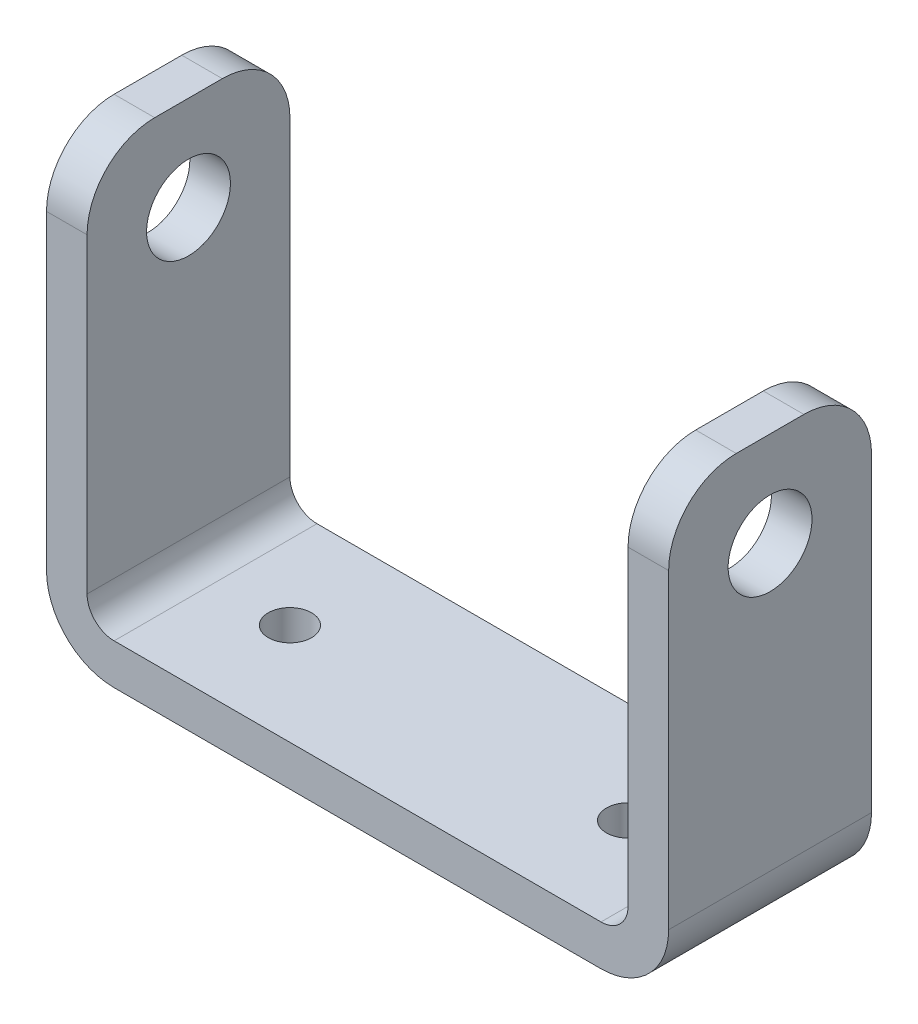
ISO-10303-21;
HEADER;
FILE_DESCRIPTION(('STEP AP214'),'2;1');
FILE_NAME('part.step','',(''),(''),'','','');
FILE_SCHEMA(('AUTOMOTIVE_DESIGN { 1 0 10303 214 1 1 1 1 }'));
ENDSEC;
DATA;
#1=APPLICATION_CONTEXT('core data for automotive mechanical design processes');
#2=APPLICATION_PROTOCOL_DEFINITION('international standard','automotive_design',2000,#1);
#3=PRODUCT_CONTEXT('',#1,'mechanical');
#4=PRODUCT('Part','Part','',(#3));
#5=PRODUCT_RELATED_PRODUCT_CATEGORY('part','',(#4));
#6=PRODUCT_DEFINITION_FORMATION('','',#4);
#7=PRODUCT_DEFINITION_CONTEXT('part definition',#1,'design');
#8=PRODUCT_DEFINITION('design','',#6,#7);
#9=PRODUCT_DEFINITION_SHAPE('','',#8);
#10=(LENGTH_UNIT() NAMED_UNIT(*) SI_UNIT(.MILLI.,.METRE.));
#11=(NAMED_UNIT(*) PLANE_ANGLE_UNIT() SI_UNIT($,.RADIAN.));
#12=(NAMED_UNIT(*) SI_UNIT($,.STERADIAN.) SOLID_ANGLE_UNIT());
#13=UNCERTAINTY_MEASURE_WITH_UNIT(LENGTH_MEASURE(1.E-05),#10,'distance_accuracy_value','');
#14=(GEOMETRIC_REPRESENTATION_CONTEXT(3) GLOBAL_UNCERTAINTY_ASSIGNED_CONTEXT((#13)) GLOBAL_UNIT_ASSIGNED_CONTEXT((#10,
#11,#12)) REPRESENTATION_CONTEXT('',''));
#15=CARTESIAN_POINT('',(0.,0.,0.));
#16=DIRECTION('',(0.,0.,1.));
#17=DIRECTION('',(1.,0.,0.));
#18=AXIS2_PLACEMENT_3D('',#15,#16,#17);
#19=CARTESIAN_POINT('',(0.,0.,15.));
#20=DIRECTION('',(0.,-1.,0.));
#21=DIRECTION('',(0.,0.,-1.));
#22=AXIS2_PLACEMENT_3D('',#19,#20,#21);
#23=PLANE('',#22);
#24=DIRECTION('',(0.,0.,-1.));
#25=VECTOR('',#24,1.);
#26=CARTESIAN_POINT('',(0.,0.,15.));
#27=LINE('',#26,#25);
#28=CARTESIAN_POINT('',(0.,0.,10.));
#29=VERTEX_POINT('',#28);
#30=CARTESIAN_POINT('',(0.,0.,5.));
#31=VERTEX_POINT('',#30);
#32=EDGE_CURVE('E283',#29,#31,#27,.T.);
#33=ORIENTED_EDGE('',*,*,#32,.T.);
#34=DIRECTION('',(-1.,0.,0.));
#35=VECTOR('',#34,1.);
#36=CARTESIAN_POINT('',(0.,0.,5.));
#37=LINE('',#36,#35);
#38=CARTESIAN_POINT('',(-3.,0.,5.));
#39=VERTEX_POINT('',#38);
#40=EDGE_CURVE('E166',#31,#39,#37,.T.);
#41=ORIENTED_EDGE('',*,*,#40,.T.);
#42=DIRECTION('',(0.,0.,-1.));
#43=VECTOR('',#42,1.);
#44=CARTESIAN_POINT('',(-3.,0.,15.));
#45=LINE('',#44,#43);
#46=CARTESIAN_POINT('',(-3.,0.,10.));
#47=VERTEX_POINT('',#46);
#48=EDGE_CURVE('E159',#47,#39,#45,.T.);
#49=ORIENTED_EDGE('',*,*,#48,.F.);
#50=DIRECTION('',(-1.,0.,0.));
#51=VECTOR('',#50,1.);
#52=CARTESIAN_POINT('',(0.,0.,10.));
#53=LINE('',#52,#51);
#54=EDGE_CURVE('E171',#47,#29,#53,.F.);
#55=ORIENTED_EDGE('',*,*,#54,.T.);
#56=EDGE_LOOP('',(#33,#41,#49,#55));
#57=FACE_BOUND('',#56,.T.);
#58=ADVANCED_FACE('F43',(#57),#23,.F.);
#59=CARTESIAN_POINT('',(-3.,0.,15.));
#60=DIRECTION('',(1.,0.,0.));
#61=DIRECTION('',(0.,1.,0.));
#62=AXIS2_PLACEMENT_3D('',#59,#60,#61);
#63=PLANE('',#62);
#64=CARTESIAN_POINT('',(-3.,-7.00000000000001,7.5));
#65=DIRECTION('',(1.,0.,0.));
#66=DIRECTION('',(0.,0.,-1.));
#67=AXIS2_PLACEMENT_3D('',#64,#65,#66);
#68=CIRCLE('',#67,3.1);
#69=CARTESIAN_POINT('',(-3.,-7.00000000000001,4.4));
#70=VERTEX_POINT('',#69);
#71=EDGE_CURVE('E326',#70,#70,#68,.T.);
#72=ORIENTED_EDGE('',*,*,#71,.T.);
#73=EDGE_LOOP('',(#72));
#74=FACE_BOUND('',#73,.T.);
#75=DIRECTION('',(0.,-1.,0.));
#76=VECTOR('',#75,1.);
#77=CARTESIAN_POINT('',(-3.,0.,0.));
#78=LINE('',#77,#76);
#79=CARTESIAN_POINT('',(-3.,-5.,0.));
#80=VERTEX_POINT('',#79);
#81=CARTESIAN_POINT('',(-3.,-28.,0.));
#82=VERTEX_POINT('',#81);
#83=EDGE_CURVE('E268',#80,#82,#78,.T.);
#84=ORIENTED_EDGE('',*,*,#83,.T.);
#85=DIRECTION('',(0.,0.,-1.));
#86=VECTOR('',#85,1.);
#87=CARTESIAN_POINT('',(-3.,-28.,15.));
#88=LINE('',#87,#86);
#89=CARTESIAN_POINT('',(-3.,-28.,15.));
#90=VERTEX_POINT('',#89);
#91=EDGE_CURVE('E11',#82,#90,#88,.F.);
#92=ORIENTED_EDGE('',*,*,#91,.T.);
#93=DIRECTION('',(0.,-1.,0.));
#94=VECTOR('',#93,1.);
#95=CARTESIAN_POINT('',(-3.,0.,15.));
#96=LINE('',#95,#94);
#97=CARTESIAN_POINT('',(-3.,-5.,15.));
#98=VERTEX_POINT('',#97);
#99=EDGE_CURVE('E160',#98,#90,#96,.T.);
#100=ORIENTED_EDGE('',*,*,#99,.F.);
#101=CARTESIAN_POINT('',(-3.,-5.,10.));
#102=DIRECTION('',(1.,0.,0.));
#103=DIRECTION('',(0.,1.,0.));
#104=AXIS2_PLACEMENT_3D('',#101,#102,#103);
#105=CIRCLE('',#104,5.);
#106=EDGE_CURVE('E156',#98,#47,#105,.F.);
#107=ORIENTED_EDGE('',*,*,#106,.T.);
#108=ORIENTED_EDGE('',*,*,#48,.T.);
#109=CARTESIAN_POINT('',(-3.,-5.,5.));
#110=DIRECTION('',(1.,0.,0.));
#111=DIRECTION('',(0.,1.,0.));
#112=AXIS2_PLACEMENT_3D('',#109,#110,#111);
#113=CIRCLE('',#112,5.);
#114=EDGE_CURVE('E165',#39,#80,#113,.F.);
#115=ORIENTED_EDGE('',*,*,#114,.T.);
#116=EDGE_LOOP('',(#84,#92,#100,#107,#108,#115));
#117=FACE_BOUND('',#116,.T.);
#118=ADVANCED_FACE('F158',(#74,#117),#63,.F.);
#119=CARTESIAN_POINT('',(-3.,-33.,15.));
#120=DIRECTION('',(0.,1.,0.));
#121=DIRECTION('',(0.,0.,1.));
#122=AXIS2_PLACEMENT_3D('',#119,#120,#121);
#123=PLANE('',#122);
#124=CARTESIAN_POINT('',(7.5,-33.,7.5));
#125=DIRECTION('',(0.,1.,0.));
#126=DIRECTION('',(0.,0.,1.));
#127=AXIS2_PLACEMENT_3D('',#124,#125,#126);
#128=CIRCLE('',#127,1.6);
#129=CARTESIAN_POINT('',(7.5,-33.,9.1));
#130=VERTEX_POINT('',#129);
#131=EDGE_CURVE('E327',#130,#130,#128,.T.);
#132=ORIENTED_EDGE('',*,*,#131,.T.);
#133=EDGE_LOOP('',(#132));
#134=FACE_BOUND('',#133,.T.);
#135=CARTESIAN_POINT('',(32.5,-33.,7.5));
#136=DIRECTION('',(0.,1.,0.));
#137=DIRECTION('',(0.,0.,1.));
#138=AXIS2_PLACEMENT_3D('',#135,#136,#137);
#139=CIRCLE('',#138,1.6);
#140=CARTESIAN_POINT('',(32.5,-33.,9.09999999999999));
#141=VERTEX_POINT('',#140);
#142=EDGE_CURVE('E330',#141,#141,#139,.T.);
#143=ORIENTED_EDGE('',*,*,#142,.T.);
#144=EDGE_LOOP('',(#143));
#145=FACE_BOUND('',#144,.T.);
#146=DIRECTION('',(1.,0.,0.));
#147=VECTOR('',#146,1.);
#148=CARTESIAN_POINT('',(-3.,-33.,0.));
#149=LINE('',#148,#147);
#150=CARTESIAN_POINT('',(2.,-33.,0.));
#151=VERTEX_POINT('',#150);
#152=CARTESIAN_POINT('',(38.,-33.,0.));
#153=VERTEX_POINT('',#152);
#154=EDGE_CURVE('E264',#151,#153,#149,.T.);
#155=ORIENTED_EDGE('',*,*,#154,.T.);
#156=DIRECTION('',(0.,0.,-1.));
#157=VECTOR('',#156,1.);
#158=CARTESIAN_POINT('',(38.,-33.,15.));
#159=LINE('',#158,#157);
#160=CARTESIAN_POINT('',(38.,-33.,15.));
#161=VERTEX_POINT('',#160);
#162=EDGE_CURVE('E64',#153,#161,#159,.F.);
#163=ORIENTED_EDGE('',*,*,#162,.T.);
#164=DIRECTION('',(1.,0.,0.));
#165=VECTOR('',#164,1.);
#166=CARTESIAN_POINT('',(-3.,-33.,15.));
#167=LINE('',#166,#165);
#168=CARTESIAN_POINT('',(2.,-33.,15.));
#169=VERTEX_POINT('',#168);
#170=EDGE_CURVE('E249',#169,#161,#167,.T.);
#171=ORIENTED_EDGE('',*,*,#170,.F.);
#172=DIRECTION('',(0.,0.,-1.));
#173=VECTOR('',#172,1.);
#174=CARTESIAN_POINT('',(2.,-33.,15.));
#175=LINE('',#174,#173);
#176=EDGE_CURVE('E239',#169,#151,#175,.T.);
#177=ORIENTED_EDGE('',*,*,#176,.T.);
#178=EDGE_LOOP('',(#155,#163,#171,#177));
#179=FACE_BOUND('',#178,.T.);
#180=ADVANCED_FACE('F266',(#134,#145,#179),#123,.F.);
#181=CARTESIAN_POINT('',(43.,-33.,15.));
#182=DIRECTION('',(-1.,0.,0.));
#183=DIRECTION('',(0.,-1.,0.));
#184=AXIS2_PLACEMENT_3D('',#181,#182,#183);
#185=PLANE('',#184);
#186=CARTESIAN_POINT('',(43.,-7.00000000000001,7.5));
#187=DIRECTION('',(1.,0.,0.));
#188=DIRECTION('',(0.,0.,-1.));
#189=AXIS2_PLACEMENT_3D('',#186,#187,#188);
#190=CIRCLE('',#189,3.1);
#191=CARTESIAN_POINT('',(43.,-7.00000000000001,4.4));
#192=VERTEX_POINT('',#191);
#193=EDGE_CURVE('E323',#192,#192,#190,.T.);
#194=ORIENTED_EDGE('',*,*,#193,.F.);
#195=EDGE_LOOP('',(#194));
#196=FACE_BOUND('',#195,.T.);
#197=DIRECTION('',(0.,1.,0.));
#198=VECTOR('',#197,1.);
#199=CARTESIAN_POINT('',(43.,-33.,15.));
#200=LINE('',#199,#198);
#201=CARTESIAN_POINT('',(43.,-28.,15.));
#202=VERTEX_POINT('',#201);
#203=CARTESIAN_POINT('',(43.,-4.99999999999999,15.));
#204=VERTEX_POINT('',#203);
#205=EDGE_CURVE('E248',#202,#204,#200,.T.);
#206=ORIENTED_EDGE('',*,*,#205,.F.);
#207=DIRECTION('',(0.,0.,-1.));
#208=VECTOR('',#207,1.);
#209=CARTESIAN_POINT('',(43.,-28.,15.));
#210=LINE('',#209,#208);
#211=CARTESIAN_POINT('',(43.,-28.,0.));
#212=VERTEX_POINT('',#211);
#213=EDGE_CURVE('E232',#202,#212,#210,.T.);
#214=ORIENTED_EDGE('',*,*,#213,.T.);
#215=DIRECTION('',(0.,1.,0.));
#216=VECTOR('',#215,1.);
#217=CARTESIAN_POINT('',(43.,-33.,0.));
#218=LINE('',#217,#216);
#219=CARTESIAN_POINT('',(43.,-4.99999999999999,0.));
#220=VERTEX_POINT('',#219);
#221=EDGE_CURVE('E265',#212,#220,#218,.T.);
#222=ORIENTED_EDGE('',*,*,#221,.T.);
#223=CARTESIAN_POINT('',(43.,-4.99999999999999,5.));
#224=DIRECTION('',(-1.,0.,0.));
#225=DIRECTION('',(0.,-1.,0.));
#226=AXIS2_PLACEMENT_3D('',#223,#224,#225);
#227=CIRCLE('',#226,5.);
#228=CARTESIAN_POINT('',(43.,0.,5.));
#229=VERTEX_POINT('',#228);
#230=EDGE_CURVE('E212',#220,#229,#227,.F.);
#231=ORIENTED_EDGE('',*,*,#230,.T.);
#232=DIRECTION('',(0.,0.,-1.));
#233=VECTOR('',#232,1.);
#234=CARTESIAN_POINT('',(43.,0.,15.));
#235=LINE('',#234,#233);
#236=CARTESIAN_POINT('',(43.,0.,10.));
#237=VERTEX_POINT('',#236);
#238=EDGE_CURVE('E174',#237,#229,#235,.T.);
#239=ORIENTED_EDGE('',*,*,#238,.F.);
#240=CARTESIAN_POINT('',(43.,-4.99999999999999,10.));
#241=DIRECTION('',(-1.,0.,0.));
#242=DIRECTION('',(0.,-1.,0.));
#243=AXIS2_PLACEMENT_3D('',#240,#241,#242);
#244=CIRCLE('',#243,5.);
#245=EDGE_CURVE('E209',#237,#204,#244,.F.);
#246=ORIENTED_EDGE('',*,*,#245,.T.);
#247=EDGE_LOOP('',(#206,#214,#222,#231,#239,#246));
#248=FACE_BOUND('',#247,.T.);
#249=ADVANCED_FACE('F253',(#196,#248),#185,.F.);
#250=CARTESIAN_POINT('',(40.,0.,15.));
#251=DIRECTION('',(0.,-1.,0.));
#252=DIRECTION('',(0.,0.,-1.));
#253=AXIS2_PLACEMENT_3D('',#250,#251,#252);
#254=PLANE('',#253);
#255=ORIENTED_EDGE('',*,*,#238,.T.);
#256=DIRECTION('',(-1.,0.,0.));
#257=VECTOR('',#256,1.);
#258=CARTESIAN_POINT('',(40.,0.,5.));
#259=LINE('',#258,#257);
#260=CARTESIAN_POINT('',(40.,0.,5.));
#261=VERTEX_POINT('',#260);
#262=EDGE_CURVE('E202',#229,#261,#259,.T.);
#263=ORIENTED_EDGE('',*,*,#262,.T.);
#264=DIRECTION('',(0.,0.,-1.));
#265=VECTOR('',#264,1.);
#266=CARTESIAN_POINT('',(40.,0.,15.));
#267=LINE('',#266,#265);
#268=CARTESIAN_POINT('',(40.,0.,10.));
#269=VERTEX_POINT('',#268);
#270=EDGE_CURVE('E285',#269,#261,#267,.T.);
#271=ORIENTED_EDGE('',*,*,#270,.F.);
#272=DIRECTION('',(-1.,0.,0.));
#273=VECTOR('',#272,1.);
#274=CARTESIAN_POINT('',(43.,0.,10.));
#275=LINE('',#274,#273);
#276=EDGE_CURVE('E200',#269,#237,#275,.F.);
#277=ORIENTED_EDGE('',*,*,#276,.T.);
#278=EDGE_LOOP('',(#255,#263,#271,#277));
#279=FACE_BOUND('',#278,.T.);
#280=ADVANCED_FACE('F292',(#279),#254,.F.);
#281=CARTESIAN_POINT('',(40.,-30.,15.));
#282=DIRECTION('',(1.,0.,0.));
#283=DIRECTION('',(0.,1.,0.));
#284=AXIS2_PLACEMENT_3D('',#281,#282,#283);
#285=PLANE('',#284);
#286=CARTESIAN_POINT('',(40.,-7.00000000000001,7.5));
#287=DIRECTION('',(1.,0.,0.));
#288=DIRECTION('',(0.,1.,0.));
#289=AXIS2_PLACEMENT_3D('',#286,#287,#288);
#290=CIRCLE('',#289,3.1);
#291=CARTESIAN_POINT('',(40.,-3.90000000000001,7.5));
#292=VERTEX_POINT('',#291);
#293=EDGE_CURVE('E272',#292,#292,#290,.T.);
#294=ORIENTED_EDGE('',*,*,#293,.T.);
#295=EDGE_LOOP('',(#294));
#296=FACE_BOUND('',#295,.T.);
#297=DIRECTION('',(0.,-1.,0.));
#298=VECTOR('',#297,1.);
#299=CARTESIAN_POINT('',(40.,-30.,0.));
#300=LINE('',#299,#298);
#301=CARTESIAN_POINT('',(40.,-4.99999999999999,0.));
#302=VERTEX_POINT('',#301);
#303=CARTESIAN_POINT('',(40.,-28.,0.));
#304=VERTEX_POINT('',#303);
#305=EDGE_CURVE('E270',#302,#304,#300,.T.);
#306=ORIENTED_EDGE('',*,*,#305,.T.);
#307=DIRECTION('',(0.,0.,-1.));
#308=VECTOR('',#307,1.);
#309=CARTESIAN_POINT('',(40.,-28.,15.));
#310=LINE('',#309,#308);
#311=CARTESIAN_POINT('',(40.,-28.,15.));
#312=VERTEX_POINT('',#311);
#313=EDGE_CURVE('E219',#304,#312,#310,.F.);
#314=ORIENTED_EDGE('',*,*,#313,.T.);
#315=DIRECTION('',(0.,-1.,0.));
#316=VECTOR('',#315,1.);
#317=CARTESIAN_POINT('',(40.,-30.,15.));
#318=LINE('',#317,#316);
#319=CARTESIAN_POINT('',(40.,-4.99999999999999,15.));
#320=VERTEX_POINT('',#319);
#321=EDGE_CURVE('E258',#320,#312,#318,.T.);
#322=ORIENTED_EDGE('',*,*,#321,.F.);
#323=CARTESIAN_POINT('',(40.,-4.99999999999999,10.));
#324=DIRECTION('',(1.,0.,0.));
#325=DIRECTION('',(0.,1.,0.));
#326=AXIS2_PLACEMENT_3D('',#323,#324,#325);
#327=CIRCLE('',#326,5.);
#328=EDGE_CURVE('E205',#320,#269,#327,.F.);
#329=ORIENTED_EDGE('',*,*,#328,.T.);
#330=ORIENTED_EDGE('',*,*,#270,.T.);
#331=CARTESIAN_POINT('',(40.,-4.99999999999999,5.));
#332=DIRECTION('',(1.,0.,0.));
#333=DIRECTION('',(0.,1.,0.));
#334=AXIS2_PLACEMENT_3D('',#331,#332,#333);
#335=CIRCLE('',#334,5.);
#336=EDGE_CURVE('E207',#261,#302,#335,.F.);
#337=ORIENTED_EDGE('',*,*,#336,.T.);
#338=EDGE_LOOP('',(#306,#314,#322,#329,#330,#337));
#339=FACE_BOUND('',#338,.T.);
#340=ADVANCED_FACE('F301',(#296,#339),#285,.F.);
#341=CARTESIAN_POINT('',(0.,-30.,15.));
#342=DIRECTION('',(0.,-1.,0.));
#343=DIRECTION('',(0.,0.,-1.));
#344=AXIS2_PLACEMENT_3D('',#341,#342,#343);
#345=PLANE('',#344);
#346=CARTESIAN_POINT('',(7.5,-30.,7.5));
#347=DIRECTION('',(0.,1.,0.));
#348=DIRECTION('',(0.,0.,1.));
#349=AXIS2_PLACEMENT_3D('',#346,#347,#348);
#350=CIRCLE('',#349,1.6);
#351=CARTESIAN_POINT('',(7.5,-30.,9.1));
#352=VERTEX_POINT('',#351);
#353=EDGE_CURVE('E336',#352,#352,#350,.T.);
#354=ORIENTED_EDGE('',*,*,#353,.F.);
#355=EDGE_LOOP('',(#354));
#356=FACE_BOUND('',#355,.T.);
#357=CARTESIAN_POINT('',(32.5,-30.,7.5));
#358=DIRECTION('',(0.,1.,0.));
#359=DIRECTION('',(0.,0.,1.));
#360=AXIS2_PLACEMENT_3D('',#357,#358,#359);
#361=CIRCLE('',#360,1.6);
#362=CARTESIAN_POINT('',(32.5,-30.,9.09999999999999));
#363=VERTEX_POINT('',#362);
#364=EDGE_CURVE('E333',#363,#363,#361,.T.);
#365=ORIENTED_EDGE('',*,*,#364,.F.);
#366=EDGE_LOOP('',(#365));
#367=FACE_BOUND('',#366,.T.);
#368=DIRECTION('',(-1.,0.,0.));
#369=VECTOR('',#368,1.);
#370=CARTESIAN_POINT('',(0.,-30.,15.));
#371=LINE('',#370,#369);
#372=CARTESIAN_POINT('',(38.,-30.,15.));
#373=VERTEX_POINT('',#372);
#374=CARTESIAN_POINT('',(2.,-30.,15.));
#375=VERTEX_POINT('',#374);
#376=EDGE_CURVE('E313',#373,#375,#371,.T.);
#377=ORIENTED_EDGE('',*,*,#376,.F.);
#378=DIRECTION('',(0.,0.,-1.));
#379=VECTOR('',#378,1.);
#380=CARTESIAN_POINT('',(38.,-30.,0.));
#381=LINE('',#380,#379);
#382=CARTESIAN_POINT('',(38.,-30.,0.));
#383=VERTEX_POINT('',#382);
#384=EDGE_CURVE('E216',#373,#383,#381,.T.);
#385=ORIENTED_EDGE('',*,*,#384,.T.);
#386=DIRECTION('',(-1.,0.,0.));
#387=VECTOR('',#386,1.);
#388=CARTESIAN_POINT('',(0.,-30.,0.));
#389=LINE('',#388,#387);
#390=CARTESIAN_POINT('',(2.,-30.,0.));
#391=VERTEX_POINT('',#390);
#392=EDGE_CURVE('E278',#383,#391,#389,.T.);
#393=ORIENTED_EDGE('',*,*,#392,.T.);
#394=DIRECTION('',(0.,0.,-1.));
#395=VECTOR('',#394,1.);
#396=CARTESIAN_POINT('',(2.,-30.,15.));
#397=LINE('',#396,#395);
#398=EDGE_CURVE('E214',#391,#375,#397,.F.);
#399=ORIENTED_EDGE('',*,*,#398,.T.);
#400=EDGE_LOOP('',(#377,#385,#393,#399));
#401=FACE_BOUND('',#400,.T.);
#402=ADVANCED_FACE('F310',(#356,#367,#401),#345,.F.);
#403=CARTESIAN_POINT('',(0.,0.,15.));
#404=DIRECTION('',(-1.,0.,0.));
#405=DIRECTION('',(0.,-1.,0.));
#406=AXIS2_PLACEMENT_3D('',#403,#404,#405);
#407=PLANE('',#406);
#408=CARTESIAN_POINT('',(0.,-7.00000000000001,7.5));
#409=DIRECTION('',(-1.,0.,0.));
#410=DIRECTION('',(0.,-1.,0.));
#411=AXIS2_PLACEMENT_3D('',#408,#409,#410);
#412=CIRCLE('',#411,3.1);
#413=CARTESIAN_POINT('',(0.,-10.1,7.5));
#414=VERTEX_POINT('',#413);
#415=EDGE_CURVE('E183',#414,#414,#412,.T.);
#416=ORIENTED_EDGE('',*,*,#415,.T.);
#417=EDGE_LOOP('',(#416));
#418=FACE_BOUND('',#417,.T.);
#419=DIRECTION('',(0.,1.,0.));
#420=VECTOR('',#419,1.);
#421=CARTESIAN_POINT('',(0.,0.,15.));
#422=LINE('',#421,#420);
#423=CARTESIAN_POINT('',(0.,-28.,15.));
#424=VERTEX_POINT('',#423);
#425=CARTESIAN_POINT('',(0.,-5.,15.));
#426=VERTEX_POINT('',#425);
#427=EDGE_CURVE('E286',#424,#426,#422,.T.);
#428=ORIENTED_EDGE('',*,*,#427,.F.);
#429=DIRECTION('',(0.,0.,-1.));
#430=VECTOR('',#429,1.);
#431=CARTESIAN_POINT('',(0.,-28.,0.));
#432=LINE('',#431,#430);
#433=CARTESIAN_POINT('',(0.,-28.,0.));
#434=VERTEX_POINT('',#433);
#435=EDGE_CURVE('E221',#424,#434,#432,.T.);
#436=ORIENTED_EDGE('',*,*,#435,.T.);
#437=DIRECTION('',(0.,1.,0.));
#438=VECTOR('',#437,1.);
#439=CARTESIAN_POINT('',(0.,0.,0.));
#440=LINE('',#439,#438);
#441=CARTESIAN_POINT('',(0.,-5.,0.));
#442=VERTEX_POINT('',#441);
#443=EDGE_CURVE('E281',#434,#442,#440,.T.);
#444=ORIENTED_EDGE('',*,*,#443,.T.);
#445=CARTESIAN_POINT('',(0.,-5.,5.));
#446=DIRECTION('',(-1.,0.,0.));
#447=DIRECTION('',(0.,-1.,0.));
#448=AXIS2_PLACEMENT_3D('',#445,#446,#447);
#449=CIRCLE('',#448,5.);
#450=EDGE_CURVE('E193',#442,#31,#449,.F.);
#451=ORIENTED_EDGE('',*,*,#450,.T.);
#452=ORIENTED_EDGE('',*,*,#32,.F.);
#453=CARTESIAN_POINT('',(0.,-5.,10.));
#454=DIRECTION('',(-1.,0.,0.));
#455=DIRECTION('',(0.,-1.,0.));
#456=AXIS2_PLACEMENT_3D('',#453,#454,#455);
#457=CIRCLE('',#456,5.);
#458=EDGE_CURVE('E179',#29,#426,#457,.F.);
#459=ORIENTED_EDGE('',*,*,#458,.T.);
#460=EDGE_LOOP('',(#428,#436,#444,#451,#452,#459));
#461=FACE_BOUND('',#460,.T.);
#462=ADVANCED_FACE('F353',(#418,#461),#407,.F.);
#463=CARTESIAN_POINT('',(0.,0.,15.));
#464=DIRECTION('',(0.,0.,1.));
#465=DIRECTION('',(1.,0.,0.));
#466=AXIS2_PLACEMENT_3D('',#463,#464,#465);
#467=PLANE('',#466);
#468=ORIENTED_EDGE('',*,*,#170,.T.);
#469=CARTESIAN_POINT('',(38.,-28.,15.));
#470=DIRECTION('',(0.,0.,1.));
#471=DIRECTION('',(1.,0.,0.));
#472=AXIS2_PLACEMENT_3D('',#469,#470,#471);
#473=CIRCLE('',#472,5.);
#474=EDGE_CURVE('E51',#161,#202,#473,.T.);
#475=ORIENTED_EDGE('',*,*,#474,.T.);
#476=ORIENTED_EDGE('',*,*,#205,.T.);
#477=DIRECTION('',(-1.,0.,0.));
#478=VECTOR('',#477,1.);
#479=CARTESIAN_POINT('',(40.,-4.99999999999999,15.));
#480=LINE('',#479,#478);
#481=EDGE_CURVE('E195',#204,#320,#480,.T.);
#482=ORIENTED_EDGE('',*,*,#481,.T.);
#483=ORIENTED_EDGE('',*,*,#321,.T.);
#484=CARTESIAN_POINT('',(38.,-28.,15.));
#485=DIRECTION('',(0.,0.,1.));
#486=DIRECTION('',(1.,0.,0.));
#487=AXIS2_PLACEMENT_3D('',#484,#485,#486);
#488=CIRCLE('',#487,2.);
#489=EDGE_CURVE('E226',#312,#373,#488,.F.);
#490=ORIENTED_EDGE('',*,*,#489,.T.);
#491=ORIENTED_EDGE('',*,*,#376,.T.);
#492=CARTESIAN_POINT('',(2.,-28.,15.));
#493=DIRECTION('',(0.,0.,1.));
#494=DIRECTION('',(1.,0.,0.));
#495=AXIS2_PLACEMENT_3D('',#492,#493,#494);
#496=CIRCLE('',#495,2.);
#497=EDGE_CURVE('E230',#375,#424,#496,.F.);
#498=ORIENTED_EDGE('',*,*,#497,.T.);
#499=ORIENTED_EDGE('',*,*,#427,.T.);
#500=DIRECTION('',(-1.,0.,0.));
#501=VECTOR('',#500,1.);
#502=CARTESIAN_POINT('',(-3.,-5.,15.));
#503=LINE('',#502,#501);
#504=EDGE_CURVE('E198',#426,#98,#503,.T.);
#505=ORIENTED_EDGE('',*,*,#504,.T.);
#506=ORIENTED_EDGE('',*,*,#99,.T.);
#507=CARTESIAN_POINT('',(2.,-28.,15.));
#508=DIRECTION('',(0.,0.,1.));
#509=DIRECTION('',(1.,0.,0.));
#510=AXIS2_PLACEMENT_3D('',#507,#508,#509);
#511=CIRCLE('',#510,5.);
#512=EDGE_CURVE('E243',#90,#169,#511,.T.);
#513=ORIENTED_EDGE('',*,*,#512,.T.);
#514=EDGE_LOOP('',(#468,#475,#476,#482,#483,#490,#491,#498,#499,#505,#506,#513));
#515=FACE_BOUND('',#514,.T.);
#516=ADVANCED_FACE('F247',(#515),#467,.T.);
#517=CARTESIAN_POINT('',(0.,0.,0.));
#518=DIRECTION('',(0.,0.,1.));
#519=DIRECTION('',(1.,0.,0.));
#520=AXIS2_PLACEMENT_3D('',#517,#518,#519);
#521=PLANE('',#520);
#522=ORIENTED_EDGE('',*,*,#221,.F.);
#523=CARTESIAN_POINT('',(38.,-28.,0.));
#524=DIRECTION('',(0.,0.,1.));
#525=DIRECTION('',(1.,0.,0.));
#526=AXIS2_PLACEMENT_3D('',#523,#524,#525);
#527=CIRCLE('',#526,5.);
#528=EDGE_CURVE('E237',#212,#153,#527,.F.);
#529=ORIENTED_EDGE('',*,*,#528,.T.);
#530=ORIENTED_EDGE('',*,*,#154,.F.);
#531=CARTESIAN_POINT('',(2.,-28.,0.));
#532=DIRECTION('',(0.,0.,1.));
#533=DIRECTION('',(1.,0.,0.));
#534=AXIS2_PLACEMENT_3D('',#531,#532,#533);
#535=CIRCLE('',#534,5.);
#536=EDGE_CURVE('E235',#151,#82,#535,.F.);
#537=ORIENTED_EDGE('',*,*,#536,.T.);
#538=ORIENTED_EDGE('',*,*,#83,.F.);
#539=DIRECTION('',(-1.,0.,0.));
#540=VECTOR('',#539,1.);
#541=CARTESIAN_POINT('',(0.,-5.,0.));
#542=LINE('',#541,#540);
#543=EDGE_CURVE('E189',#80,#442,#542,.F.);
#544=ORIENTED_EDGE('',*,*,#543,.T.);
#545=ORIENTED_EDGE('',*,*,#443,.F.);
#546=CARTESIAN_POINT('',(2.,-28.,0.));
#547=DIRECTION('',(0.,0.,1.));
#548=DIRECTION('',(1.,0.,0.));
#549=AXIS2_PLACEMENT_3D('',#546,#547,#548);
#550=CIRCLE('',#549,2.);
#551=EDGE_CURVE('E228',#434,#391,#550,.T.);
#552=ORIENTED_EDGE('',*,*,#551,.T.);
#553=ORIENTED_EDGE('',*,*,#392,.F.);
#554=CARTESIAN_POINT('',(38.,-28.,0.));
#555=DIRECTION('',(0.,0.,1.));
#556=DIRECTION('',(1.,0.,0.));
#557=AXIS2_PLACEMENT_3D('',#554,#555,#556);
#558=CIRCLE('',#557,2.);
#559=EDGE_CURVE('E224',#383,#304,#558,.T.);
#560=ORIENTED_EDGE('',*,*,#559,.T.);
#561=ORIENTED_EDGE('',*,*,#305,.F.);
#562=DIRECTION('',(-1.,0.,0.));
#563=VECTOR('',#562,1.);
#564=CARTESIAN_POINT('',(0.,-4.99999999999999,0.));
#565=LINE('',#564,#563);
#566=EDGE_CURVE('E186',#302,#220,#565,.F.);
#567=ORIENTED_EDGE('',*,*,#566,.T.);
#568=EDGE_LOOP('',(#522,#529,#530,#537,#538,#544,#545,#552,#553,#560,#561,#567));
#569=FACE_BOUND('',#568,.T.);
#570=ADVANCED_FACE('F263',(#569),#521,.F.);
#571=CARTESIAN_POINT('',(-3.,-7.00000000000001,7.5));
#572=DIRECTION('',(1.,0.,0.));
#573=DIRECTION('',(0.,0.,-1.));
#574=AXIS2_PLACEMENT_3D('',#571,#572,#573);
#575=CYLINDRICAL_SURFACE('',#574,3.1);
#576=ORIENTED_EDGE('',*,*,#71,.F.);
#577=EDGE_LOOP('',(#576));
#578=FACE_BOUND('',#577,.T.);
#579=ORIENTED_EDGE('',*,*,#415,.F.);
#580=EDGE_LOOP('',(#579));
#581=FACE_BOUND('',#580,.T.);
#582=ADVANCED_FACE('F446',(#578,#581),#575,.F.);
#583=ORIENTED_EDGE('',*,*,#193,.T.);
#584=EDGE_LOOP('',(#583));
#585=FACE_BOUND('',#584,.T.);
#586=ORIENTED_EDGE('',*,*,#293,.F.);
#587=EDGE_LOOP('',(#586));
#588=FACE_BOUND('',#587,.T.);
#589=ADVANCED_FACE('F382',(#585,#588),#575,.F.);
#590=CARTESIAN_POINT('',(0.,-5.,5.));
#591=DIRECTION('',(-1.,0.,0.));
#592=DIRECTION('',(0.,0.,1.));
#593=AXIS2_PLACEMENT_3D('',#590,#591,#592);
#594=CYLINDRICAL_SURFACE('',#593,5.);
#595=ORIENTED_EDGE('',*,*,#450,.F.);
#596=ORIENTED_EDGE('',*,*,#543,.F.);
#597=ORIENTED_EDGE('',*,*,#114,.F.);
#598=ORIENTED_EDGE('',*,*,#40,.F.);
#599=EDGE_LOOP('',(#595,#596,#597,#598));
#600=FACE_BOUND('',#599,.T.);
#601=ADVANCED_FACE('F379',(#600),#594,.T.);
#602=CARTESIAN_POINT('',(0.,-5.,10.));
#603=DIRECTION('',(1.,0.,0.));
#604=DIRECTION('',(0.,0.,-1.));
#605=AXIS2_PLACEMENT_3D('',#602,#603,#604);
#606=CYLINDRICAL_SURFACE('',#605,5.);
#607=ORIENTED_EDGE('',*,*,#458,.F.);
#608=ORIENTED_EDGE('',*,*,#54,.F.);
#609=ORIENTED_EDGE('',*,*,#106,.F.);
#610=ORIENTED_EDGE('',*,*,#504,.F.);
#611=EDGE_LOOP('',(#607,#608,#609,#610));
#612=FACE_BOUND('',#611,.T.);
#613=ADVANCED_FACE('F177',(#612),#606,.T.);
#614=CARTESIAN_POINT('',(40.,-4.99999999999999,5.));
#615=DIRECTION('',(-1.,0.,0.));
#616=DIRECTION('',(0.,0.,1.));
#617=AXIS2_PLACEMENT_3D('',#614,#615,#616);
#618=CYLINDRICAL_SURFACE('',#617,5.);
#619=ORIENTED_EDGE('',*,*,#230,.F.);
#620=ORIENTED_EDGE('',*,*,#566,.F.);
#621=ORIENTED_EDGE('',*,*,#336,.F.);
#622=ORIENTED_EDGE('',*,*,#262,.F.);
#623=EDGE_LOOP('',(#619,#620,#621,#622));
#624=FACE_BOUND('',#623,.T.);
#625=ADVANCED_FACE('F297',(#624),#618,.T.);
#626=CARTESIAN_POINT('',(0.,-4.99999999999999,10.));
#627=DIRECTION('',(1.,0.,0.));
#628=DIRECTION('',(0.,0.,-1.));
#629=AXIS2_PLACEMENT_3D('',#626,#627,#628);
#630=CYLINDRICAL_SURFACE('',#629,5.);
#631=ORIENTED_EDGE('',*,*,#245,.F.);
#632=ORIENTED_EDGE('',*,*,#276,.F.);
#633=ORIENTED_EDGE('',*,*,#328,.F.);
#634=ORIENTED_EDGE('',*,*,#481,.F.);
#635=EDGE_LOOP('',(#631,#632,#633,#634));
#636=FACE_BOUND('',#635,.T.);
#637=ADVANCED_FACE('F358',(#636),#630,.T.);
#638=CARTESIAN_POINT('',(32.5,-33.,7.5));
#639=DIRECTION('',(0.,1.,0.));
#640=DIRECTION('',(0.,0.,1.));
#641=AXIS2_PLACEMENT_3D('',#638,#639,#640);
#642=CYLINDRICAL_SURFACE('',#641,1.6);
#643=ORIENTED_EDGE('',*,*,#142,.F.);
#644=EDGE_LOOP('',(#643));
#645=FACE_BOUND('',#644,.T.);
#646=ORIENTED_EDGE('',*,*,#364,.T.);
#647=EDGE_LOOP('',(#646));
#648=FACE_BOUND('',#647,.T.);
#649=ADVANCED_FACE('F347',(#645,#648),#642,.F.);
#650=CARTESIAN_POINT('',(7.5,-33.,7.5));
#651=DIRECTION('',(0.,1.,0.));
#652=DIRECTION('',(0.,0.,1.));
#653=AXIS2_PLACEMENT_3D('',#650,#651,#652);
#654=CYLINDRICAL_SURFACE('',#653,1.6);
#655=ORIENTED_EDGE('',*,*,#131,.F.);
#656=EDGE_LOOP('',(#655));
#657=FACE_BOUND('',#656,.T.);
#658=ORIENTED_EDGE('',*,*,#353,.T.);
#659=EDGE_LOOP('',(#658));
#660=FACE_BOUND('',#659,.T.);
#661=ADVANCED_FACE('F344',(#657,#660),#654,.F.);
#662=CARTESIAN_POINT('',(38.,-28.,15.));
#663=DIRECTION('',(0.,0.,1.));
#664=DIRECTION('',(1.,0.,0.));
#665=AXIS2_PLACEMENT_3D('',#662,#663,#664);
#666=CYLINDRICAL_SURFACE('',#665,2.);
#667=ORIENTED_EDGE('',*,*,#489,.F.);
#668=ORIENTED_EDGE('',*,*,#313,.F.);
#669=ORIENTED_EDGE('',*,*,#559,.F.);
#670=ORIENTED_EDGE('',*,*,#384,.F.);
#671=EDGE_LOOP('',(#667,#668,#669,#670));
#672=FACE_BOUND('',#671,.T.);
#673=ADVANCED_FACE('F307',(#672),#666,.F.);
#674=CARTESIAN_POINT('',(2.,-28.,15.));
#675=DIRECTION('',(0.,0.,1.));
#676=DIRECTION('',(1.,0.,0.));
#677=AXIS2_PLACEMENT_3D('',#674,#675,#676);
#678=CYLINDRICAL_SURFACE('',#677,2.);
#679=ORIENTED_EDGE('',*,*,#497,.F.);
#680=ORIENTED_EDGE('',*,*,#398,.F.);
#681=ORIENTED_EDGE('',*,*,#551,.F.);
#682=ORIENTED_EDGE('',*,*,#435,.F.);
#683=EDGE_LOOP('',(#679,#680,#681,#682));
#684=FACE_BOUND('',#683,.T.);
#685=ADVANCED_FACE('F390',(#684),#678,.F.);
#686=CARTESIAN_POINT('',(38.,-28.,15.));
#687=DIRECTION('',(0.,0.,-1.));
#688=DIRECTION('',(-1.,0.,0.));
#689=AXIS2_PLACEMENT_3D('',#686,#687,#688);
#690=CYLINDRICAL_SURFACE('',#689,5.);
#691=ORIENTED_EDGE('',*,*,#474,.F.);
#692=ORIENTED_EDGE('',*,*,#162,.F.);
#693=ORIENTED_EDGE('',*,*,#528,.F.);
#694=ORIENTED_EDGE('',*,*,#213,.F.);
#695=EDGE_LOOP('',(#691,#692,#693,#694));
#696=FACE_BOUND('',#695,.T.);
#697=ADVANCED_FACE('F260',(#696),#690,.T.);
#698=CARTESIAN_POINT('',(2.,-28.,15.));
#699=DIRECTION('',(0.,0.,-1.));
#700=DIRECTION('',(-1.,0.,0.));
#701=AXIS2_PLACEMENT_3D('',#698,#699,#700);
#702=CYLINDRICAL_SURFACE('',#701,5.);
#703=ORIENTED_EDGE('',*,*,#512,.F.);
#704=ORIENTED_EDGE('',*,*,#91,.F.);
#705=ORIENTED_EDGE('',*,*,#536,.F.);
#706=ORIENTED_EDGE('',*,*,#176,.F.);
#707=EDGE_LOOP('',(#703,#704,#705,#706));
#708=FACE_BOUND('',#707,.T.);
#709=ADVANCED_FACE('F45',(#708),#702,.T.);
#710=CLOSED_SHELL('',(#58,#118,#180,#249,#280,#340,#402,#462,#516,#570,#582,#589,#601,#613,#625,
#637,#649,#661,#673,#685,#697,#709));
#711=MANIFOLD_SOLID_BREP('B2',#710);
#712=ADVANCED_BREP_SHAPE_REPRESENTATION('',(#18,#711),#14);
#713=SHAPE_DEFINITION_REPRESENTATION(#9,#712);
ENDSEC;
END-ISO-10303-21;
